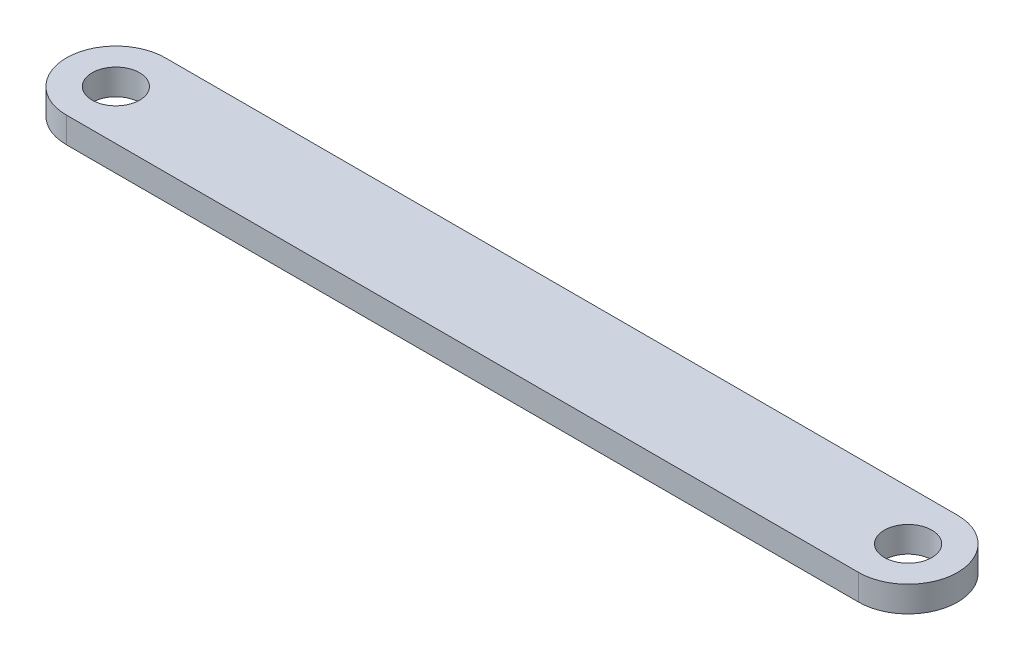
ISO-10303-21;
HEADER;
FILE_DESCRIPTION(('STEP AP214'),'2;1');
FILE_NAME('part.step','',(''),(''),'','','');
FILE_SCHEMA(('AUTOMOTIVE_DESIGN { 1 0 10303 214 1 1 1 1 }'));
ENDSEC;
DATA;
#1=APPLICATION_CONTEXT('core data for automotive mechanical design processes');
#2=APPLICATION_PROTOCOL_DEFINITION('international standard','automotive_design',2000,#1);
#3=PRODUCT_CONTEXT('',#1,'mechanical');
#4=PRODUCT('Part','Part','',(#3));
#5=PRODUCT_RELATED_PRODUCT_CATEGORY('part','',(#4));
#6=PRODUCT_DEFINITION_FORMATION('','',#4);
#7=PRODUCT_DEFINITION_CONTEXT('part definition',#1,'design');
#8=PRODUCT_DEFINITION('design','',#6,#7);
#9=PRODUCT_DEFINITION_SHAPE('','',#8);
#10=(LENGTH_UNIT() NAMED_UNIT(*) SI_UNIT(.MILLI.,.METRE.));
#11=(NAMED_UNIT(*) PLANE_ANGLE_UNIT() SI_UNIT($,.RADIAN.));
#12=(NAMED_UNIT(*) SI_UNIT($,.STERADIAN.) SOLID_ANGLE_UNIT());
#13=UNCERTAINTY_MEASURE_WITH_UNIT(LENGTH_MEASURE(1.E-05),#10,'distance_accuracy_value','');
#14=(GEOMETRIC_REPRESENTATION_CONTEXT(3) GLOBAL_UNCERTAINTY_ASSIGNED_CONTEXT((#13)) GLOBAL_UNIT_ASSIGNED_CONTEXT((#10,
#11,#12)) REPRESENTATION_CONTEXT('',''));
#15=CARTESIAN_POINT('',(0.,0.,0.));
#16=DIRECTION('',(0.,0.,1.));
#17=DIRECTION('',(1.,0.,0.));
#18=AXIS2_PLACEMENT_3D('',#15,#16,#17);
#19=CARTESIAN_POINT('',(-100.,3.25,0.));
#20=DIRECTION('',(0.,1.,0.));
#21=DIRECTION('',(0.,0.,1.));
#22=AXIS2_PLACEMENT_3D('',#19,#20,#21);
#23=PLANE('',#22);
#24=CARTESIAN_POINT('',(100.,3.25,0.));
#25=DIRECTION('',(0.,1.,0.));
#26=DIRECTION('',(0.,0.,1.));
#27=AXIS2_PLACEMENT_3D('',#24,#25,#26);
#28=CIRCLE('',#27,6.);
#29=CARTESIAN_POINT('',(100.,3.25,-6.));
#30=VERTEX_POINT('',#29);
#31=EDGE_CURVE('E118',#30,#30,#28,.T.);
#32=ORIENTED_EDGE('',*,*,#31,.F.);
#33=EDGE_LOOP('',(#32));
#34=FACE_BOUND('',#33,.T.);
#35=CARTESIAN_POINT('',(-100.,3.25,0.));
#36=DIRECTION('',(0.,1.,0.));
#37=DIRECTION('',(0.,0.,1.));
#38=AXIS2_PLACEMENT_3D('',#35,#36,#37);
#39=CIRCLE('',#38,12.5);
#40=CARTESIAN_POINT('',(-100.,3.25,-12.5));
#41=VERTEX_POINT('',#40);
#42=CARTESIAN_POINT('',(-100.,3.25,12.5));
#43=VERTEX_POINT('',#42);
#44=EDGE_CURVE('E98',#41,#43,#39,.T.);
#45=ORIENTED_EDGE('',*,*,#44,.T.);
#46=DIRECTION('',(1.,0.,0.));
#47=VECTOR('',#46,1.);
#48=CARTESIAN_POINT('',(-100.,3.25,12.5));
#49=LINE('',#48,#47);
#50=CARTESIAN_POINT('',(100.,3.25,12.5));
#51=VERTEX_POINT('',#50);
#52=EDGE_CURVE('E93',#43,#51,#49,.T.);
#53=ORIENTED_EDGE('',*,*,#52,.T.);
#54=CARTESIAN_POINT('',(100.,3.25,0.));
#55=DIRECTION('',(0.,1.,0.));
#56=DIRECTION('',(0.,0.,1.));
#57=AXIS2_PLACEMENT_3D('',#54,#55,#56);
#58=CIRCLE('',#57,12.5);
#59=CARTESIAN_POINT('',(100.,3.25,-12.5000000000001));
#60=VERTEX_POINT('',#59);
#61=EDGE_CURVE('E96',#51,#60,#58,.T.);
#62=ORIENTED_EDGE('',*,*,#61,.T.);
#63=DIRECTION('',(-1.,0.,0.));
#64=VECTOR('',#63,1.);
#65=CARTESIAN_POINT('',(-100.,3.25,-12.5));
#66=LINE('',#65,#64);
#67=EDGE_CURVE('E63',#60,#41,#66,.T.);
#68=ORIENTED_EDGE('',*,*,#67,.T.);
#69=EDGE_LOOP('',(#45,#53,#62,#68));
#70=FACE_BOUND('',#69,.T.);
#71=CARTESIAN_POINT('',(-100.,3.25,0.));
#72=DIRECTION('',(0.,1.,0.));
#73=DIRECTION('',(0.,0.,1.));
#74=AXIS2_PLACEMENT_3D('',#71,#72,#73);
#75=CIRCLE('',#74,6.);
#76=CARTESIAN_POINT('',(-100.,3.25,-6.));
#77=VERTEX_POINT('',#76);
#78=EDGE_CURVE('E140',#77,#77,#75,.T.);
#79=ORIENTED_EDGE('',*,*,#78,.F.);
#80=EDGE_LOOP('',(#79));
#81=FACE_BOUND('',#80,.T.);
#82=ADVANCED_FACE('F45',(#34,#70,#81),#23,.T.);
#83=CARTESIAN_POINT('',(-100.,-3.25,0.));
#84=DIRECTION('',(0.,1.,0.));
#85=DIRECTION('',(0.,0.,1.));
#86=AXIS2_PLACEMENT_3D('',#83,#84,#85);
#87=PLANE('',#86);
#88=CARTESIAN_POINT('',(-100.,-3.25,0.));
#89=DIRECTION('',(0.,1.,0.));
#90=DIRECTION('',(0.,0.,1.));
#91=AXIS2_PLACEMENT_3D('',#88,#89,#90);
#92=CIRCLE('',#91,12.5);
#93=CARTESIAN_POINT('',(-100.,-3.25,-12.5));
#94=VERTEX_POINT('',#93);
#95=CARTESIAN_POINT('',(-100.,-3.25,12.5));
#96=VERTEX_POINT('',#95);
#97=EDGE_CURVE('E114',#94,#96,#92,.T.);
#98=ORIENTED_EDGE('',*,*,#97,.F.);
#99=DIRECTION('',(-1.,0.,0.));
#100=VECTOR('',#99,1.);
#101=CARTESIAN_POINT('',(-100.,-3.25,-12.5));
#102=LINE('',#101,#100);
#103=CARTESIAN_POINT('',(100.,-3.25,-12.5000000000001));
#104=VERTEX_POINT('',#103);
#105=EDGE_CURVE('E86',#104,#94,#102,.T.);
#106=ORIENTED_EDGE('',*,*,#105,.F.);
#107=CARTESIAN_POINT('',(100.,-3.25,0.));
#108=DIRECTION('',(0.,1.,0.));
#109=DIRECTION('',(0.,0.,1.));
#110=AXIS2_PLACEMENT_3D('',#107,#108,#109);
#111=CIRCLE('',#110,12.5);
#112=CARTESIAN_POINT('',(100.,-3.25,12.5));
#113=VERTEX_POINT('',#112);
#114=EDGE_CURVE('E80',#113,#104,#111,.T.);
#115=ORIENTED_EDGE('',*,*,#114,.F.);
#116=DIRECTION('',(1.,0.,0.));
#117=VECTOR('',#116,1.);
#118=CARTESIAN_POINT('',(-100.,-3.25,12.5));
#119=LINE('',#118,#117);
#120=EDGE_CURVE('E103',#96,#113,#119,.T.);
#121=ORIENTED_EDGE('',*,*,#120,.F.);
#122=EDGE_LOOP('',(#98,#106,#115,#121));
#123=FACE_BOUND('',#122,.T.);
#124=CARTESIAN_POINT('',(100.,-3.25,0.));
#125=DIRECTION('',(0.,1.,0.));
#126=DIRECTION('',(0.,0.,1.));
#127=AXIS2_PLACEMENT_3D('',#124,#125,#126);
#128=CIRCLE('',#127,6.);
#129=CARTESIAN_POINT('',(100.,-3.25,-6.));
#130=VERTEX_POINT('',#129);
#131=EDGE_CURVE('E136',#130,#130,#128,.T.);
#132=ORIENTED_EDGE('',*,*,#131,.T.);
#133=EDGE_LOOP('',(#132));
#134=FACE_BOUND('',#133,.T.);
#135=CARTESIAN_POINT('',(-100.,-3.25,0.));
#136=DIRECTION('',(0.,1.,0.));
#137=DIRECTION('',(0.,0.,1.));
#138=AXIS2_PLACEMENT_3D('',#135,#136,#137);
#139=CIRCLE('',#138,6.);
#140=CARTESIAN_POINT('',(-100.,-3.25,-6.));
#141=VERTEX_POINT('',#140);
#142=EDGE_CURVE('E144',#141,#141,#139,.T.);
#143=ORIENTED_EDGE('',*,*,#142,.T.);
#144=EDGE_LOOP('',(#143));
#145=FACE_BOUND('',#144,.T.);
#146=ADVANCED_FACE('F131',(#123,#134,#145),#87,.F.);
#147=CARTESIAN_POINT('',(-100.,3.25,0.));
#148=DIRECTION('',(0.,-1.,0.));
#149=DIRECTION('',(0.,0.,-1.));
#150=AXIS2_PLACEMENT_3D('',#147,#148,#149);
#151=CYLINDRICAL_SURFACE('',#150,12.5);
#152=ORIENTED_EDGE('',*,*,#97,.T.);
#153=DIRECTION('',(0.,-1.,0.));
#154=VECTOR('',#153,1.);
#155=CARTESIAN_POINT('',(-100.,3.25,12.5));
#156=LINE('',#155,#154);
#157=EDGE_CURVE('E11',#43,#96,#156,.T.);
#158=ORIENTED_EDGE('',*,*,#157,.F.);
#159=ORIENTED_EDGE('',*,*,#44,.F.);
#160=DIRECTION('',(0.,-1.,0.));
#161=VECTOR('',#160,1.);
#162=CARTESIAN_POINT('',(-100.,3.25,-12.5));
#163=LINE('',#162,#161);
#164=EDGE_CURVE('E110',#41,#94,#163,.T.);
#165=ORIENTED_EDGE('',*,*,#164,.T.);
#166=EDGE_LOOP('',(#152,#158,#159,#165));
#167=FACE_BOUND('',#166,.T.);
#168=ADVANCED_FACE('F47',(#167),#151,.T.);
#169=CARTESIAN_POINT('',(-100.,3.25,12.5));
#170=DIRECTION('',(0.,0.,-1.));
#171=DIRECTION('',(-1.,0.,0.));
#172=AXIS2_PLACEMENT_3D('',#169,#170,#171);
#173=PLANE('',#172);
#174=ORIENTED_EDGE('',*,*,#120,.T.);
#175=DIRECTION('',(0.,-1.,0.));
#176=VECTOR('',#175,1.);
#177=CARTESIAN_POINT('',(100.,3.25,12.5));
#178=LINE('',#177,#176);
#179=EDGE_CURVE('E55',#51,#113,#178,.T.);
#180=ORIENTED_EDGE('',*,*,#179,.F.);
#181=ORIENTED_EDGE('',*,*,#52,.F.);
#182=ORIENTED_EDGE('',*,*,#157,.T.);
#183=EDGE_LOOP('',(#174,#180,#181,#182));
#184=FACE_BOUND('',#183,.T.);
#185=ADVANCED_FACE('F102',(#184),#173,.F.);
#186=CARTESIAN_POINT('',(100.,3.25,0.));
#187=DIRECTION('',(0.,-1.,0.));
#188=DIRECTION('',(0.,0.,-1.));
#189=AXIS2_PLACEMENT_3D('',#186,#187,#188);
#190=CYLINDRICAL_SURFACE('',#189,12.5);
#191=ORIENTED_EDGE('',*,*,#114,.T.);
#192=DIRECTION('',(0.,-1.,0.));
#193=VECTOR('',#192,1.);
#194=CARTESIAN_POINT('',(100.,3.25,-12.5000000000001));
#195=LINE('',#194,#193);
#196=EDGE_CURVE('E105',#60,#104,#195,.T.);
#197=ORIENTED_EDGE('',*,*,#196,.F.);
#198=ORIENTED_EDGE('',*,*,#61,.F.);
#199=ORIENTED_EDGE('',*,*,#179,.T.);
#200=EDGE_LOOP('',(#191,#197,#198,#199));
#201=FACE_BOUND('',#200,.T.);
#202=ADVANCED_FACE('F106',(#201),#190,.T.);
#203=CARTESIAN_POINT('',(-100.,3.25,-12.5));
#204=DIRECTION('',(0.,0.,1.));
#205=DIRECTION('',(1.,0.,0.));
#206=AXIS2_PLACEMENT_3D('',#203,#204,#205);
#207=PLANE('',#206);
#208=ORIENTED_EDGE('',*,*,#105,.T.);
#209=ORIENTED_EDGE('',*,*,#164,.F.);
#210=ORIENTED_EDGE('',*,*,#67,.F.);
#211=ORIENTED_EDGE('',*,*,#196,.T.);
#212=EDGE_LOOP('',(#208,#209,#210,#211));
#213=FACE_BOUND('',#212,.T.);
#214=ADVANCED_FACE('F128',(#213),#207,.F.);
#215=CARTESIAN_POINT('',(100.,3.25,0.));
#216=DIRECTION('',(0.,-1.,0.));
#217=DIRECTION('',(0.,0.,-1.));
#218=AXIS2_PLACEMENT_3D('',#215,#216,#217);
#219=CYLINDRICAL_SURFACE('',#218,6.);
#220=CARTESIAN_POINT('',(100.,3.25,-6.));
#221=CARTESIAN_POINT('',(100.,3.18229166666667,-6.));
#222=CARTESIAN_POINT('',(100.,3.11458333333333,-6.));
#223=CARTESIAN_POINT('',(100.,2.97916666666667,-6.));
#224=CARTESIAN_POINT('',(100.,2.91145833333333,-6.));
#225=CARTESIAN_POINT('',(100.,2.77604166666667,-6.));
#226=CARTESIAN_POINT('',(100.,2.70833333333333,-6.));
#227=CARTESIAN_POINT('',(100.,2.57291666666667,-6.));
#228=CARTESIAN_POINT('',(100.,2.50520833333333,-6.));
#229=CARTESIAN_POINT('',(100.,2.36979166666667,-6.));
#230=CARTESIAN_POINT('',(100.,2.30208333333333,-6.));
#231=CARTESIAN_POINT('',(100.,2.16666666666667,-6.));
#232=CARTESIAN_POINT('',(100.,2.09895833333333,-6.));
#233=CARTESIAN_POINT('',(100.,1.96354166666667,-6.));
#234=CARTESIAN_POINT('',(100.,1.89583333333333,-6.));
#235=CARTESIAN_POINT('',(100.,1.76041666666667,-6.));
#236=CARTESIAN_POINT('',(100.,1.69270833333333,-6.));
#237=CARTESIAN_POINT('',(100.,1.55729166666667,-6.));
#238=CARTESIAN_POINT('',(100.,1.48958333333333,-6.));
#239=CARTESIAN_POINT('',(100.,1.35416666666667,-6.));
#240=CARTESIAN_POINT('',(100.,1.28645833333333,-6.));
#241=CARTESIAN_POINT('',(100.,1.15104166666667,-6.));
#242=CARTESIAN_POINT('',(100.,1.08333333333333,-6.));
#243=CARTESIAN_POINT('',(100.,0.947916666666667,-6.));
#244=CARTESIAN_POINT('',(100.,0.880208333333333,-6.));
#245=CARTESIAN_POINT('',(100.,0.744791666666667,-6.));
#246=CARTESIAN_POINT('',(100.,0.677083333333333,-6.));
#247=CARTESIAN_POINT('',(100.,0.541666666666667,-6.));
#248=CARTESIAN_POINT('',(100.,0.473958333333333,-6.));
#249=CARTESIAN_POINT('',(100.,0.338541666666667,-6.));
#250=CARTESIAN_POINT('',(100.,0.270833333333333,-6.));
#251=CARTESIAN_POINT('',(100.,0.135416666666667,-6.));
#252=CARTESIAN_POINT('',(100.,0.0677083333333334,-6.));
#253=CARTESIAN_POINT('',(100.,-0.0677083333333334,-6.));
#254=CARTESIAN_POINT('',(100.,-0.135416666666667,-6.));
#255=CARTESIAN_POINT('',(100.,-0.270833333333333,-6.));
#256=CARTESIAN_POINT('',(100.,-0.338541666666667,-6.));
#257=CARTESIAN_POINT('',(100.,-0.473958333333333,-6.));
#258=CARTESIAN_POINT('',(100.,-0.541666666666667,-6.));
#259=CARTESIAN_POINT('',(100.,-0.677083333333333,-6.));
#260=CARTESIAN_POINT('',(100.,-0.744791666666666,-6.));
#261=CARTESIAN_POINT('',(100.,-0.880208333333333,-6.));
#262=CARTESIAN_POINT('',(100.,-0.947916666666666,-6.));
#263=CARTESIAN_POINT('',(100.,-1.08333333333333,-6.));
#264=CARTESIAN_POINT('',(100.,-1.15104166666667,-6.));
#265=CARTESIAN_POINT('',(100.,-1.28645833333333,-6.));
#266=CARTESIAN_POINT('',(100.,-1.35416666666667,-6.));
#267=CARTESIAN_POINT('',(100.,-1.48958333333333,-6.));
#268=CARTESIAN_POINT('',(100.,-1.55729166666667,-6.));
#269=CARTESIAN_POINT('',(100.,-1.69270833333333,-6.));
#270=CARTESIAN_POINT('',(100.,-1.76041666666667,-6.));
#271=CARTESIAN_POINT('',(100.,-1.89583333333333,-6.));
#272=CARTESIAN_POINT('',(100.,-1.96354166666667,-6.));
#273=CARTESIAN_POINT('',(100.,-2.09895833333333,-6.));
#274=CARTESIAN_POINT('',(100.,-2.16666666666667,-6.));
#275=CARTESIAN_POINT('',(100.,-2.30208333333333,-6.));
#276=CARTESIAN_POINT('',(100.,-2.36979166666667,-6.));
#277=CARTESIAN_POINT('',(100.,-2.50520833333333,-6.));
#278=CARTESIAN_POINT('',(100.,-2.57291666666667,-6.));
#279=CARTESIAN_POINT('',(100.,-2.70833333333333,-6.));
#280=CARTESIAN_POINT('',(100.,-2.77604166666667,-6.));
#281=CARTESIAN_POINT('',(100.,-2.91145833333333,-6.));
#282=CARTESIAN_POINT('',(100.,-2.97916666666667,-6.));
#283=CARTESIAN_POINT('',(100.,-3.11458333333333,-6.));
#284=CARTESIAN_POINT('',(100.,-3.18229166666667,-6.));
#285=CARTESIAN_POINT('',(100.,-3.25,-6.));
#286=B_SPLINE_CURVE_WITH_KNOTS('',3,(#220,#221,#222,#223,#224,#225,#226,#227,#228,#229,#230,
#231,#232,#233,#234,#235,#236,#237,#238,#239,#240,#241,#242,#243,#244,#245,#246,#247,#248,#249,
#250,#251,#252,#253,#254,#255,#256,#257,#258,#259,#260,#261,#262,#263,#264,#265,#266,#267,#268,
#269,#270,#271,#272,#273,#274,#275,#276,#277,#278,#279,#280,#281,#282,#283,#284,#285),
.UNSPECIFIED.,.F.,.F.,(4,2,2,2,2,2,2,2,2,2,2,2,2,2,2,2,2,2,2,2,2,2,2,2,2,2,2,2,2,2,2,2,4),(0.,
0.203125,0.40625,0.609375,0.8125,1.015625,1.21875,1.421875,1.625,1.828125,2.03125,2.234375,
2.4375,2.640625,2.84375,3.046875,3.25,3.453125,3.65625,3.859375,4.0625,4.265625,4.46875,
4.671875,4.875,5.078125,5.28125,5.484375,5.6875,5.890625,6.09375,6.296875,6.5),.UNSPECIFIED.);
#287=EDGE_CURVE('BSEAM163',#30,#130,#286,.T.);
#288=ORIENTED_EDGE('',*,*,#31,.T.);
#289=ORIENTED_EDGE('',*,*,#131,.F.);
#290=ORIENTED_EDGE('',*,*,#287,.T.);
#291=ORIENTED_EDGE('',*,*,#287,.F.);
#292=EDGE_LOOP('',(#288,#290,#289,#291));
#293=FACE_BOUND('',#292,.T.);
#294=ADVANCED_FACE('F163',(#293),#219,.F.);
#295=CARTESIAN_POINT('',(-100.,3.25,0.));
#296=DIRECTION('',(0.,-1.,0.));
#297=DIRECTION('',(0.,0.,-1.));
#298=AXIS2_PLACEMENT_3D('',#295,#296,#297);
#299=CYLINDRICAL_SURFACE('',#298,6.);
#300=CARTESIAN_POINT('',(-100.,3.25,-6.));
#301=CARTESIAN_POINT('',(-100.,3.18229166666667,-6.));
#302=CARTESIAN_POINT('',(-100.,3.11458333333333,-6.));
#303=CARTESIAN_POINT('',(-100.,2.97916666666667,-6.));
#304=CARTESIAN_POINT('',(-100.,2.91145833333333,-6.));
#305=CARTESIAN_POINT('',(-100.,2.77604166666667,-6.));
#306=CARTESIAN_POINT('',(-100.,2.70833333333333,-6.));
#307=CARTESIAN_POINT('',(-100.,2.57291666666667,-6.));
#308=CARTESIAN_POINT('',(-100.,2.50520833333333,-6.));
#309=CARTESIAN_POINT('',(-100.,2.36979166666667,-6.));
#310=CARTESIAN_POINT('',(-100.,2.30208333333333,-6.));
#311=CARTESIAN_POINT('',(-100.,2.16666666666667,-6.));
#312=CARTESIAN_POINT('',(-100.,2.09895833333333,-6.));
#313=CARTESIAN_POINT('',(-100.,1.96354166666667,-6.));
#314=CARTESIAN_POINT('',(-100.,1.89583333333333,-6.));
#315=CARTESIAN_POINT('',(-100.,1.76041666666667,-6.));
#316=CARTESIAN_POINT('',(-100.,1.69270833333333,-6.));
#317=CARTESIAN_POINT('',(-100.,1.55729166666667,-6.));
#318=CARTESIAN_POINT('',(-100.,1.48958333333333,-6.));
#319=CARTESIAN_POINT('',(-100.,1.35416666666667,-6.));
#320=CARTESIAN_POINT('',(-100.,1.28645833333333,-6.));
#321=CARTESIAN_POINT('',(-100.,1.15104166666667,-6.));
#322=CARTESIAN_POINT('',(-100.,1.08333333333333,-6.));
#323=CARTESIAN_POINT('',(-100.,0.947916666666667,-6.));
#324=CARTESIAN_POINT('',(-100.,0.880208333333333,-6.));
#325=CARTESIAN_POINT('',(-100.,0.744791666666667,-6.));
#326=CARTESIAN_POINT('',(-100.,0.677083333333333,-6.));
#327=CARTESIAN_POINT('',(-100.,0.541666666666667,-6.));
#328=CARTESIAN_POINT('',(-100.,0.473958333333333,-6.));
#329=CARTESIAN_POINT('',(-100.,0.338541666666667,-6.));
#330=CARTESIAN_POINT('',(-100.,0.270833333333333,-6.));
#331=CARTESIAN_POINT('',(-100.,0.135416666666667,-6.));
#332=CARTESIAN_POINT('',(-100.,0.0677083333333334,-6.));
#333=CARTESIAN_POINT('',(-100.,-0.0677083333333334,-6.));
#334=CARTESIAN_POINT('',(-100.,-0.135416666666667,-6.));
#335=CARTESIAN_POINT('',(-100.,-0.270833333333333,-6.));
#336=CARTESIAN_POINT('',(-100.,-0.338541666666667,-6.));
#337=CARTESIAN_POINT('',(-100.,-0.473958333333333,-6.));
#338=CARTESIAN_POINT('',(-100.,-0.541666666666667,-6.));
#339=CARTESIAN_POINT('',(-100.,-0.677083333333333,-6.));
#340=CARTESIAN_POINT('',(-100.,-0.744791666666666,-6.));
#341=CARTESIAN_POINT('',(-100.,-0.880208333333333,-6.));
#342=CARTESIAN_POINT('',(-100.,-0.947916666666666,-6.));
#343=CARTESIAN_POINT('',(-100.,-1.08333333333333,-6.));
#344=CARTESIAN_POINT('',(-100.,-1.15104166666667,-6.));
#345=CARTESIAN_POINT('',(-100.,-1.28645833333333,-6.));
#346=CARTESIAN_POINT('',(-100.,-1.35416666666667,-6.));
#347=CARTESIAN_POINT('',(-100.,-1.48958333333333,-6.));
#348=CARTESIAN_POINT('',(-100.,-1.55729166666667,-6.));
#349=CARTESIAN_POINT('',(-100.,-1.69270833333333,-6.));
#350=CARTESIAN_POINT('',(-100.,-1.76041666666667,-6.));
#351=CARTESIAN_POINT('',(-100.,-1.89583333333333,-6.));
#352=CARTESIAN_POINT('',(-100.,-1.96354166666667,-6.));
#353=CARTESIAN_POINT('',(-100.,-2.09895833333333,-6.));
#354=CARTESIAN_POINT('',(-100.,-2.16666666666667,-6.));
#355=CARTESIAN_POINT('',(-100.,-2.30208333333333,-6.));
#356=CARTESIAN_POINT('',(-100.,-2.36979166666667,-6.));
#357=CARTESIAN_POINT('',(-100.,-2.50520833333333,-6.));
#358=CARTESIAN_POINT('',(-100.,-2.57291666666667,-6.));
#359=CARTESIAN_POINT('',(-100.,-2.70833333333333,-6.));
#360=CARTESIAN_POINT('',(-100.,-2.77604166666667,-6.));
#361=CARTESIAN_POINT('',(-100.,-2.91145833333333,-6.));
#362=CARTESIAN_POINT('',(-100.,-2.97916666666667,-6.));
#363=CARTESIAN_POINT('',(-100.,-3.11458333333333,-6.));
#364=CARTESIAN_POINT('',(-100.,-3.18229166666667,-6.));
#365=CARTESIAN_POINT('',(-100.,-3.25,-6.));
#366=B_SPLINE_CURVE_WITH_KNOTS('',3,(#300,#301,#302,#303,#304,#305,#306,#307,#308,#309,#310,
#311,#312,#313,#314,#315,#316,#317,#318,#319,#320,#321,#322,#323,#324,#325,#326,#327,#328,#329,
#330,#331,#332,#333,#334,#335,#336,#337,#338,#339,#340,#341,#342,#343,#344,#345,#346,#347,#348,
#349,#350,#351,#352,#353,#354,#355,#356,#357,#358,#359,#360,#361,#362,#363,#364,#365),
.UNSPECIFIED.,.F.,.F.,(4,2,2,2,2,2,2,2,2,2,2,2,2,2,2,2,2,2,2,2,2,2,2,2,2,2,2,2,2,2,2,2,4),(0.,
0.203125,0.40625,0.609375,0.8125,1.015625,1.21875,1.421875,1.625,1.828125,2.03125,2.234375,
2.4375,2.640625,2.84375,3.046875,3.25,3.453125,3.65625,3.859375,4.0625,4.265625,4.46875,
4.671875,4.875,5.078125,5.28125,5.484375,5.6875,5.890625,6.09375,6.296875,6.5),.UNSPECIFIED.);
#367=EDGE_CURVE('BSEAM152',#77,#141,#366,.T.);
#368=ORIENTED_EDGE('',*,*,#78,.T.);
#369=ORIENTED_EDGE('',*,*,#142,.F.);
#370=ORIENTED_EDGE('',*,*,#367,.T.);
#371=ORIENTED_EDGE('',*,*,#367,.F.);
#372=EDGE_LOOP('',(#368,#370,#369,#371));
#373=FACE_BOUND('',#372,.T.);
#374=ADVANCED_FACE('F152',(#373),#299,.F.);
#375=CLOSED_SHELL('',(#82,#146,#168,#185,#202,#214,#294,#374));
#376=MANIFOLD_SOLID_BREP('B2',#375);
#377=ADVANCED_BREP_SHAPE_REPRESENTATION('',(#18,#376),#14);
#378=SHAPE_DEFINITION_REPRESENTATION(#9,#377);
ENDSEC;
END-ISO-10303-21;
